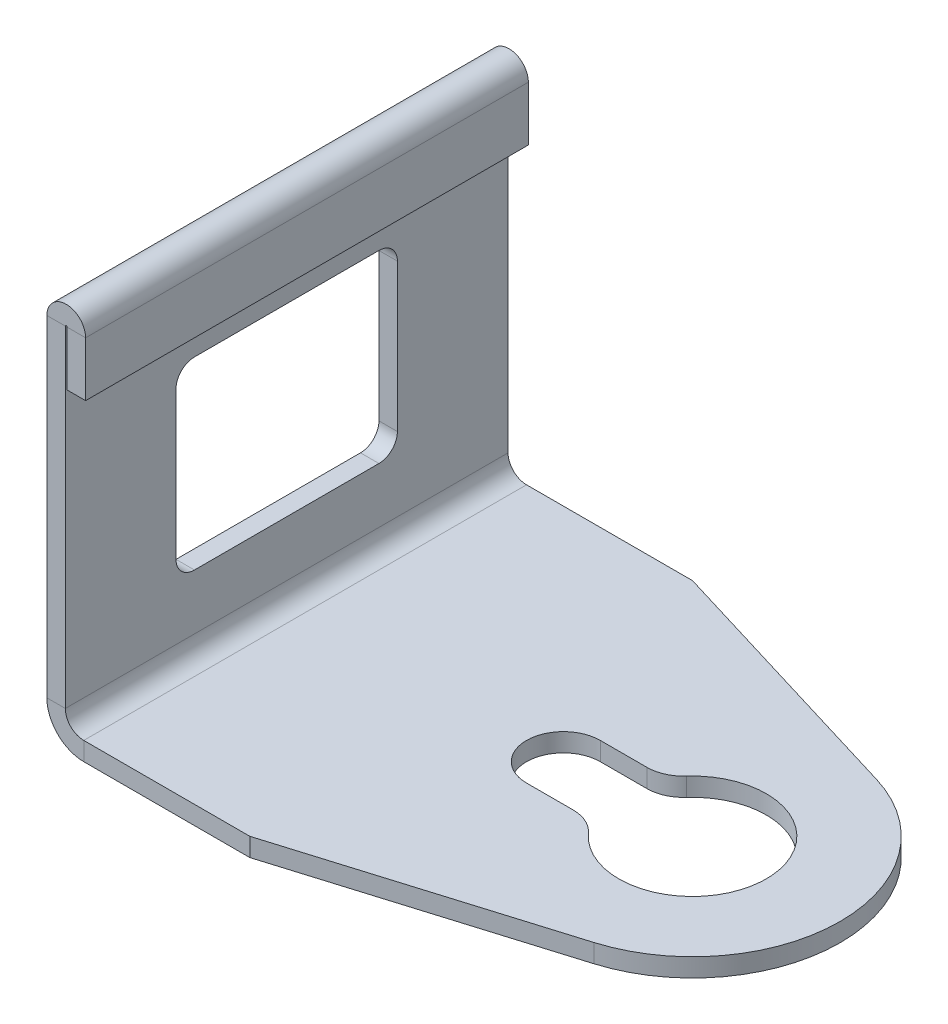
ISO-10303-21;
HEADER;
FILE_DESCRIPTION(('STEP AP214'),'2;1');
FILE_NAME('part.step','',(''),(''),'','','');
FILE_SCHEMA(('AUTOMOTIVE_DESIGN { 1 0 10303 214 1 1 1 1 }'));
ENDSEC;
DATA;
#1=APPLICATION_CONTEXT('core data for automotive mechanical design processes');
#2=APPLICATION_PROTOCOL_DEFINITION('international standard','automotive_design',2000,#1);
#3=PRODUCT_CONTEXT('',#1,'mechanical');
#4=PRODUCT('Part','Part','',(#3));
#5=PRODUCT_RELATED_PRODUCT_CATEGORY('part','',(#4));
#6=PRODUCT_DEFINITION_FORMATION('','',#4);
#7=PRODUCT_DEFINITION_CONTEXT('part definition',#1,'design');
#8=PRODUCT_DEFINITION('design','',#6,#7);
#9=PRODUCT_DEFINITION_SHAPE('','',#8);
#10=(LENGTH_UNIT() NAMED_UNIT(*) SI_UNIT(.MILLI.,.METRE.));
#11=(NAMED_UNIT(*) PLANE_ANGLE_UNIT() SI_UNIT($,.RADIAN.));
#12=(NAMED_UNIT(*) SI_UNIT($,.STERADIAN.) SOLID_ANGLE_UNIT());
#13=UNCERTAINTY_MEASURE_WITH_UNIT(LENGTH_MEASURE(1.E-05),#10,'distance_accuracy_value','');
#14=(GEOMETRIC_REPRESENTATION_CONTEXT(3) GLOBAL_UNCERTAINTY_ASSIGNED_CONTEXT((#13)) GLOBAL_UNIT_ASSIGNED_CONTEXT((#10,
#11,#12)) REPRESENTATION_CONTEXT('',''));
#15=CARTESIAN_POINT('',(0.,0.,0.));
#16=DIRECTION('',(0.,0.,1.));
#17=DIRECTION('',(1.,0.,0.));
#18=AXIS2_PLACEMENT_3D('',#15,#16,#17);
#19=CARTESIAN_POINT('',(-2.,0.,12.));
#20=DIRECTION('',(0.,0.,1.));
#21=DIRECTION('',(1.,0.,0.));
#22=AXIS2_PLACEMENT_3D('',#19,#20,#21);
#23=PLANE('',#22);
#24=DIRECTION('',(0.,1.,0.));
#25=VECTOR('',#24,1.);
#26=CARTESIAN_POINT('',(-0.999999999999997,0.,12.));
#27=LINE('',#26,#25);
#28=CARTESIAN_POINT('',(-1.00000000000006,18.95,12.));
#29=VERTEX_POINT('',#28);
#30=CARTESIAN_POINT('',(-1.,0.999999999999997,12.));
#31=VERTEX_POINT('',#30);
#32=EDGE_CURVE('E376',#29,#31,#27,.F.);
#33=ORIENTED_EDGE('',*,*,#32,.F.);
#34=DIRECTION('',(-1.,0.,0.));
#35=VECTOR('',#34,1.);
#36=CARTESIAN_POINT('',(-1.00000000000006,18.95,12.));
#37=LINE('',#36,#35);
#38=CARTESIAN_POINT('',(-2.00000000000006,18.95,12.));
#39=VERTEX_POINT('',#38);
#40=EDGE_CURVE('E323',#29,#39,#37,.T.);
#41=ORIENTED_EDGE('',*,*,#40,.T.);
#42=DIRECTION('',(0.,-1.,0.));
#43=VECTOR('',#42,1.);
#44=CARTESIAN_POINT('',(-2.,0.,12.));
#45=LINE('',#44,#43);
#46=CARTESIAN_POINT('',(-2.,0.999999999999993,12.));
#47=VERTEX_POINT('',#46);
#48=EDGE_CURVE('E370',#39,#47,#45,.T.);
#49=ORIENTED_EDGE('',*,*,#48,.T.);
#50=DIRECTION('',(-1.,0.,0.));
#51=VECTOR('',#50,1.);
#52=CARTESIAN_POINT('',(-1.,0.999999999999997,12.));
#53=LINE('',#52,#51);
#54=EDGE_CURVE('E384',#31,#47,#53,.T.);
#55=ORIENTED_EDGE('',*,*,#54,.F.);
#56=EDGE_LOOP('',(#33,#41,#49,#55));
#57=FACE_BOUND('',#56,.T.);
#58=ADVANCED_FACE('F61',(#57),#23,.T.);
#59=CARTESIAN_POINT('',(0.,-1.,-12.));
#60=DIRECTION('',(0.,0.,-1.));
#61=DIRECTION('',(-1.,0.,0.));
#62=AXIS2_PLACEMENT_3D('',#59,#60,#61);
#63=PLANE('',#62);
#64=DIRECTION('',(-1.,0.,0.));
#65=VECTOR('',#64,1.);
#66=CARTESIAN_POINT('',(0.,0.,-12.));
#67=LINE('',#66,#65);
#68=CARTESIAN_POINT('',(9.,0.,-12.));
#69=VERTEX_POINT('',#68);
#70=CARTESIAN_POINT('',(0.,0.,-12.));
#71=VERTEX_POINT('',#70);
#72=EDGE_CURVE('E456',#69,#71,#67,.T.);
#73=ORIENTED_EDGE('',*,*,#72,.F.);
#74=DIRECTION('',(0.,1.,0.));
#75=VECTOR('',#74,1.);
#76=CARTESIAN_POINT('',(9.,-1.,-12.));
#77=LINE('',#76,#75);
#78=CARTESIAN_POINT('',(9.,-1.,-12.));
#79=VERTEX_POINT('',#78);
#80=EDGE_CURVE('E70',#79,#69,#77,.T.);
#81=ORIENTED_EDGE('',*,*,#80,.F.);
#82=DIRECTION('',(-1.,0.,0.));
#83=VECTOR('',#82,1.);
#84=CARTESIAN_POINT('',(0.,-1.,-12.));
#85=LINE('',#84,#83);
#86=CARTESIAN_POINT('',(0.,-1.,-12.));
#87=VERTEX_POINT('',#86);
#88=EDGE_CURVE('E468',#79,#87,#85,.T.);
#89=ORIENTED_EDGE('',*,*,#88,.T.);
#90=DIRECTION('',(0.,1.,0.));
#91=VECTOR('',#90,1.);
#92=CARTESIAN_POINT('',(0.,-1.,-12.));
#93=LINE('',#92,#91);
#94=EDGE_CURVE('E13',#87,#71,#93,.T.);
#95=ORIENTED_EDGE('',*,*,#94,.T.);
#96=EDGE_LOOP('',(#73,#81,#89,#95));
#97=FACE_BOUND('',#96,.T.);
#98=ADVANCED_FACE('F537',(#97),#63,.T.);
#99=CARTESIAN_POINT('',(9.,-1.,-12.));
#100=DIRECTION('',(0.29027623112899,0.,-0.956942897795657));
#101=DIRECTION('',(-0.956942897795657,0.,-0.29027623112899));
#102=AXIS2_PLACEMENT_3D('',#99,#100,#101);
#103=PLANE('',#102);
#104=DIRECTION('',(-0.956942897795657,0.,-0.29027623112899));
#105=VECTOR('',#104,1.);
#106=CARTESIAN_POINT('',(9.,0.,-12.));
#107=LINE('',#106,#105);
#108=CARTESIAN_POINT('',(23.3222098490319,0.,-7.65554318236525));
#109=VERTEX_POINT('',#108);
#110=EDGE_CURVE('E482',#109,#69,#107,.T.);
#111=ORIENTED_EDGE('',*,*,#110,.F.);
#112=DIRECTION('',(0.,1.,0.));
#113=VECTOR('',#112,1.);
#114=CARTESIAN_POINT('',(23.3222098490319,-1.,-7.65554318236525));
#115=LINE('',#114,#113);
#116=CARTESIAN_POINT('',(23.3222098490319,-1.,-7.65554318236525));
#117=VERTEX_POINT('',#116);
#118=EDGE_CURVE('E488',#117,#109,#115,.T.);
#119=ORIENTED_EDGE('',*,*,#118,.F.);
#120=DIRECTION('',(-0.956942897795657,0.,-0.29027623112899));
#121=VECTOR('',#120,1.);
#122=CARTESIAN_POINT('',(9.,-1.,-12.));
#123=LINE('',#122,#121);
#124=EDGE_CURVE('E465',#117,#79,#123,.T.);
#125=ORIENTED_EDGE('',*,*,#124,.T.);
#126=ORIENTED_EDGE('',*,*,#80,.T.);
#127=EDGE_LOOP('',(#111,#119,#125,#126));
#128=FACE_BOUND('',#127,.T.);
#129=ADVANCED_FACE('F557',(#128),#103,.T.);
#130=CARTESIAN_POINT('',(21.,-1.,0.));
#131=DIRECTION('',(0.,1.,0.));
#132=DIRECTION('',(0.,0.,1.));
#133=AXIS2_PLACEMENT_3D('',#130,#131,#132);
#134=CYLINDRICAL_SURFACE('',#133,8.);
#135=CARTESIAN_POINT('',(21.,0.,0.));
#136=DIRECTION('',(0.,1.,0.));
#137=DIRECTION('',(0.,0.,1.));
#138=AXIS2_PLACEMENT_3D('',#135,#136,#137);
#139=CIRCLE('',#138,8.);
#140=CARTESIAN_POINT('',(23.3222098490319,0.,7.65554318236525));
#141=VERTEX_POINT('',#140);
#142=EDGE_CURVE('E479',#141,#109,#139,.T.);
#143=ORIENTED_EDGE('',*,*,#142,.F.);
#144=DIRECTION('',(0.,1.,0.));
#145=VECTOR('',#144,1.);
#146=CARTESIAN_POINT('',(23.3222098490319,-1.,7.65554318236525));
#147=LINE('',#146,#145);
#148=CARTESIAN_POINT('',(23.3222098490319,-1.,7.65554318236525));
#149=VERTEX_POINT('',#148);
#150=EDGE_CURVE('E490',#149,#141,#147,.T.);
#151=ORIENTED_EDGE('',*,*,#150,.F.);
#152=CARTESIAN_POINT('',(21.,-1.,0.));
#153=DIRECTION('',(0.,1.,0.));
#154=DIRECTION('',(0.,0.,1.));
#155=AXIS2_PLACEMENT_3D('',#152,#153,#154);
#156=CIRCLE('',#155,8.);
#157=EDGE_CURVE('E462',#149,#117,#156,.T.);
#158=ORIENTED_EDGE('',*,*,#157,.T.);
#159=ORIENTED_EDGE('',*,*,#118,.T.);
#160=EDGE_LOOP('',(#143,#151,#158,#159));
#161=FACE_BOUND('',#160,.T.);
#162=ADVANCED_FACE('F955',(#161),#134,.T.);
#163=CARTESIAN_POINT('',(9.,-1.,12.));
#164=DIRECTION('',(0.29027623112899,0.,0.956942897795657));
#165=DIRECTION('',(0.956942897795657,0.,-0.29027623112899));
#166=AXIS2_PLACEMENT_3D('',#163,#164,#165);
#167=PLANE('',#166);
#168=DIRECTION('',(0.956942897795657,0.,-0.29027623112899));
#169=VECTOR('',#168,1.);
#170=CARTESIAN_POINT('',(9.,0.,12.));
#171=LINE('',#170,#169);
#172=CARTESIAN_POINT('',(9.,0.,12.));
#173=VERTEX_POINT('',#172);
#174=EDGE_CURVE('E476',#173,#141,#171,.T.);
#175=ORIENTED_EDGE('',*,*,#174,.F.);
#176=DIRECTION('',(0.,1.,0.));
#177=VECTOR('',#176,1.);
#178=CARTESIAN_POINT('',(9.,-1.,12.));
#179=LINE('',#178,#177);
#180=CARTESIAN_POINT('',(9.,-1.,12.));
#181=VERTEX_POINT('',#180);
#182=EDGE_CURVE('E491',#181,#173,#179,.T.);
#183=ORIENTED_EDGE('',*,*,#182,.F.);
#184=DIRECTION('',(0.956942897795657,0.,-0.29027623112899));
#185=VECTOR('',#184,1.);
#186=CARTESIAN_POINT('',(9.,-1.,12.));
#187=LINE('',#186,#185);
#188=EDGE_CURVE('E459',#181,#149,#187,.T.);
#189=ORIENTED_EDGE('',*,*,#188,.T.);
#190=ORIENTED_EDGE('',*,*,#150,.T.);
#191=EDGE_LOOP('',(#175,#183,#189,#190));
#192=FACE_BOUND('',#191,.T.);
#193=ADVANCED_FACE('F946',(#192),#167,.T.);
#194=CARTESIAN_POINT('',(0.,-1.,12.));
#195=DIRECTION('',(0.,0.,1.));
#196=DIRECTION('',(1.,0.,0.));
#197=AXIS2_PLACEMENT_3D('',#194,#195,#196);
#198=PLANE('',#197);
#199=DIRECTION('',(1.,0.,0.));
#200=VECTOR('',#199,1.);
#201=CARTESIAN_POINT('',(0.,0.,12.));
#202=LINE('',#201,#200);
#203=CARTESIAN_POINT('',(0.,0.,12.));
#204=VERTEX_POINT('',#203);
#205=EDGE_CURVE('E473',#204,#173,#202,.T.);
#206=ORIENTED_EDGE('',*,*,#205,.F.);
#207=DIRECTION('',(0.,1.,0.));
#208=VECTOR('',#207,1.);
#209=CARTESIAN_POINT('',(0.,-1.,12.));
#210=LINE('',#209,#208);
#211=CARTESIAN_POINT('',(0.,-1.,12.));
#212=VERTEX_POINT('',#211);
#213=EDGE_CURVE('E65',#212,#204,#210,.T.);
#214=ORIENTED_EDGE('',*,*,#213,.F.);
#215=DIRECTION('',(1.,0.,0.));
#216=VECTOR('',#215,1.);
#217=CARTESIAN_POINT('',(0.,-1.,12.));
#218=LINE('',#217,#216);
#219=EDGE_CURVE('E455',#212,#181,#218,.T.);
#220=ORIENTED_EDGE('',*,*,#219,.T.);
#221=ORIENTED_EDGE('',*,*,#182,.T.);
#222=EDGE_LOOP('',(#206,#214,#220,#221));
#223=FACE_BOUND('',#222,.T.);
#224=ADVANCED_FACE('F63',(#223),#198,.T.);
#225=CARTESIAN_POINT('',(21.,-1.,0.));
#226=DIRECTION('',(0.,1.,0.));
#227=DIRECTION('',(0.,0.,1.));
#228=AXIS2_PLACEMENT_3D('',#225,#226,#227);
#229=PLANE('',#228);
#230=CARTESIAN_POINT('',(21.,-1.,0.));
#231=DIRECTION('',(0.,1.,0.));
#232=DIRECTION('',(0.,0.,1.));
#233=AXIS2_PLACEMENT_3D('',#230,#231,#232);
#234=CIRCLE('',#233,4.);
#235=CARTESIAN_POINT('',(18.0185760300003,-1.,2.66666666666667));
#236=VERTEX_POINT('',#235);
#237=CARTESIAN_POINT('',(18.0185760300003,-1.,-2.66666666666667));
#238=VERTEX_POINT('',#237);
#239=EDGE_CURVE('E420',#236,#238,#234,.T.);
#240=ORIENTED_EDGE('',*,*,#239,.T.);
#241=CARTESIAN_POINT('',(16.5278640450004,-1.,-4.));
#242=DIRECTION('',(0.,-1.,0.));
#243=DIRECTION('',(0.,0.,1.));
#244=AXIS2_PLACEMENT_3D('',#241,#242,#243);
#245=CIRCLE('',#244,2.);
#246=CARTESIAN_POINT('',(16.5278640450004,-1.,-2.));
#247=VERTEX_POINT('',#246);
#248=EDGE_CURVE('E404',#238,#247,#245,.T.);
#249=ORIENTED_EDGE('',*,*,#248,.T.);
#250=DIRECTION('',(-1.,0.,0.));
#251=VECTOR('',#250,1.);
#252=CARTESIAN_POINT('',(14.,-1.,-2.));
#253=LINE('',#252,#251);
#254=CARTESIAN_POINT('',(14.,-1.,-2.));
#255=VERTEX_POINT('',#254);
#256=EDGE_CURVE('E407',#247,#255,#253,.T.);
#257=ORIENTED_EDGE('',*,*,#256,.T.);
#258=CARTESIAN_POINT('',(14.,-1.,0.));
#259=DIRECTION('',(0.,1.,0.));
#260=DIRECTION('',(0.,0.,1.));
#261=AXIS2_PLACEMENT_3D('',#258,#259,#260);
#262=CIRCLE('',#261,2.);
#263=CARTESIAN_POINT('',(14.,-1.,2.));
#264=VERTEX_POINT('',#263);
#265=EDGE_CURVE('E411',#255,#264,#262,.T.);
#266=ORIENTED_EDGE('',*,*,#265,.T.);
#267=DIRECTION('',(1.,0.,0.));
#268=VECTOR('',#267,1.);
#269=CARTESIAN_POINT('',(14.,-1.,2.));
#270=LINE('',#269,#268);
#271=CARTESIAN_POINT('',(16.5278640450004,-1.,2.));
#272=VERTEX_POINT('',#271);
#273=EDGE_CURVE('E414',#264,#272,#270,.T.);
#274=ORIENTED_EDGE('',*,*,#273,.T.);
#275=CARTESIAN_POINT('',(16.5278640450004,-1.,4.));
#276=DIRECTION('',(0.,-1.,0.));
#277=DIRECTION('',(0.,0.,-1.));
#278=AXIS2_PLACEMENT_3D('',#275,#276,#277);
#279=CIRCLE('',#278,2.);
#280=EDGE_CURVE('E417',#272,#236,#279,.T.);
#281=ORIENTED_EDGE('',*,*,#280,.T.);
#282=EDGE_LOOP('',(#240,#249,#257,#266,#274,#281));
#283=FACE_BOUND('',#282,.T.);
#284=DIRECTION('',(0.,0.,1.));
#285=VECTOR('',#284,1.);
#286=CARTESIAN_POINT('',(0.,-1.,-12.));
#287=LINE('',#286,#285);
#288=EDGE_CURVE('E452',#87,#212,#287,.T.);
#289=ORIENTED_EDGE('',*,*,#288,.F.);
#290=ORIENTED_EDGE('',*,*,#88,.F.);
#291=ORIENTED_EDGE('',*,*,#124,.F.);
#292=ORIENTED_EDGE('',*,*,#157,.F.);
#293=ORIENTED_EDGE('',*,*,#188,.F.);
#294=ORIENTED_EDGE('',*,*,#219,.F.);
#295=EDGE_LOOP('',(#289,#290,#291,#292,#293,#294));
#296=FACE_BOUND('',#295,.T.);
#297=ADVANCED_FACE('F531',(#283,#296),#229,.F.);
#298=CARTESIAN_POINT('',(21.,0.,0.));
#299=DIRECTION('',(0.,1.,0.));
#300=DIRECTION('',(0.,0.,1.));
#301=AXIS2_PLACEMENT_3D('',#298,#299,#300);
#302=PLANE('',#301);
#303=CARTESIAN_POINT('',(16.5278640450004,0.,-4.));
#304=DIRECTION('',(0.,-1.,0.));
#305=DIRECTION('',(0.,0.,1.));
#306=AXIS2_PLACEMENT_3D('',#303,#304,#305);
#307=CIRCLE('',#306,2.);
#308=CARTESIAN_POINT('',(18.0185760300003,0.,-2.66666666666667));
#309=VERTEX_POINT('',#308);
#310=CARTESIAN_POINT('',(16.5278640450004,0.,-2.));
#311=VERTEX_POINT('',#310);
#312=EDGE_CURVE('E395',#309,#311,#307,.T.);
#313=ORIENTED_EDGE('',*,*,#312,.F.);
#314=CARTESIAN_POINT('',(21.,0.,0.));
#315=DIRECTION('',(0.,1.,0.));
#316=DIRECTION('',(0.,0.,1.));
#317=AXIS2_PLACEMENT_3D('',#314,#315,#316);
#318=CIRCLE('',#317,4.);
#319=CARTESIAN_POINT('',(18.0185760300003,0.,2.66666666666667));
#320=VERTEX_POINT('',#319);
#321=EDGE_CURVE('E408',#320,#309,#318,.T.);
#322=ORIENTED_EDGE('',*,*,#321,.F.);
#323=CARTESIAN_POINT('',(16.5278640450004,0.,4.));
#324=DIRECTION('',(0.,-1.,0.));
#325=DIRECTION('',(0.,0.,-1.));
#326=AXIS2_PLACEMENT_3D('',#323,#324,#325);
#327=CIRCLE('',#326,2.);
#328=CARTESIAN_POINT('',(16.5278640450004,0.,2.));
#329=VERTEX_POINT('',#328);
#330=EDGE_CURVE('E434',#329,#320,#327,.T.);
#331=ORIENTED_EDGE('',*,*,#330,.F.);
#332=DIRECTION('',(1.,0.,0.));
#333=VECTOR('',#332,1.);
#334=CARTESIAN_POINT('',(14.,0.,2.));
#335=LINE('',#334,#333);
#336=CARTESIAN_POINT('',(14.,0.,2.));
#337=VERTEX_POINT('',#336);
#338=EDGE_CURVE('E431',#337,#329,#335,.T.);
#339=ORIENTED_EDGE('',*,*,#338,.F.);
#340=CARTESIAN_POINT('',(14.,0.,0.));
#341=DIRECTION('',(0.,1.,0.));
#342=DIRECTION('',(0.,0.,1.));
#343=AXIS2_PLACEMENT_3D('',#340,#341,#342);
#344=CIRCLE('',#343,2.);
#345=CARTESIAN_POINT('',(14.,0.,-2.));
#346=VERTEX_POINT('',#345);
#347=EDGE_CURVE('E428',#346,#337,#344,.T.);
#348=ORIENTED_EDGE('',*,*,#347,.F.);
#349=DIRECTION('',(-1.,0.,0.));
#350=VECTOR('',#349,1.);
#351=CARTESIAN_POINT('',(14.,0.,-2.));
#352=LINE('',#351,#350);
#353=EDGE_CURVE('E425',#311,#346,#352,.T.);
#354=ORIENTED_EDGE('',*,*,#353,.F.);
#355=EDGE_LOOP('',(#313,#322,#331,#339,#348,#354));
#356=FACE_BOUND('',#355,.T.);
#357=DIRECTION('',(0.,0.,1.));
#358=VECTOR('',#357,1.);
#359=CARTESIAN_POINT('',(0.,0.,-12.));
#360=LINE('',#359,#358);
#361=EDGE_CURVE('E441',#71,#204,#360,.T.);
#362=ORIENTED_EDGE('',*,*,#361,.T.);
#363=ORIENTED_EDGE('',*,*,#205,.T.);
#364=ORIENTED_EDGE('',*,*,#174,.T.);
#365=ORIENTED_EDGE('',*,*,#142,.T.);
#366=ORIENTED_EDGE('',*,*,#110,.T.);
#367=ORIENTED_EDGE('',*,*,#72,.T.);
#368=EDGE_LOOP('',(#362,#363,#364,#365,#366,#367));
#369=FACE_BOUND('',#368,.T.);
#370=ADVANCED_FACE('F912',(#356,#369),#302,.T.);
#371=CARTESIAN_POINT('',(16.5278640450004,-1.,-4.));
#372=DIRECTION('',(0.,1.,0.));
#373=DIRECTION('',(0.,0.,1.));
#374=AXIS2_PLACEMENT_3D('',#371,#372,#373);
#375=CYLINDRICAL_SURFACE('',#374,2.);
#376=ORIENTED_EDGE('',*,*,#312,.T.);
#377=DIRECTION('',(0.,1.,0.));
#378=VECTOR('',#377,1.);
#379=CARTESIAN_POINT('',(16.5278640450004,-1.,-2.));
#380=LINE('',#379,#378);
#381=EDGE_CURVE('E423',#247,#311,#380,.T.);
#382=ORIENTED_EDGE('',*,*,#381,.F.);
#383=ORIENTED_EDGE('',*,*,#248,.F.);
#384=DIRECTION('',(0.,1.,0.));
#385=VECTOR('',#384,1.);
#386=CARTESIAN_POINT('',(18.0185760300003,-1.,-2.66666666666667));
#387=LINE('',#386,#385);
#388=EDGE_CURVE('E439',#238,#309,#387,.T.);
#389=ORIENTED_EDGE('',*,*,#388,.T.);
#390=EDGE_LOOP('',(#376,#382,#383,#389));
#391=FACE_BOUND('',#390,.T.);
#392=ADVANCED_FACE('F900',(#391),#375,.T.);
#393=CARTESIAN_POINT('',(21.,-1.,0.));
#394=DIRECTION('',(0.,1.,0.));
#395=DIRECTION('',(0.,0.,1.));
#396=AXIS2_PLACEMENT_3D('',#393,#394,#395);
#397=CYLINDRICAL_SURFACE('',#396,4.);
#398=ORIENTED_EDGE('',*,*,#321,.T.);
#399=ORIENTED_EDGE('',*,*,#388,.F.);
#400=ORIENTED_EDGE('',*,*,#239,.F.);
#401=DIRECTION('',(0.,1.,0.));
#402=VECTOR('',#401,1.);
#403=CARTESIAN_POINT('',(18.0185760300003,-1.,2.66666666666667));
#404=LINE('',#403,#402);
#405=EDGE_CURVE('E442',#236,#320,#404,.T.);
#406=ORIENTED_EDGE('',*,*,#405,.T.);
#407=EDGE_LOOP('',(#398,#399,#400,#406));
#408=FACE_BOUND('',#407,.T.);
#409=ADVANCED_FACE('F888',(#408),#397,.F.);
#410=CARTESIAN_POINT('',(16.5278640450004,-1.,4.));
#411=DIRECTION('',(0.,1.,0.));
#412=DIRECTION('',(0.,0.,1.));
#413=AXIS2_PLACEMENT_3D('',#410,#411,#412);
#414=CYLINDRICAL_SURFACE('',#413,2.);
#415=ORIENTED_EDGE('',*,*,#330,.T.);
#416=ORIENTED_EDGE('',*,*,#405,.F.);
#417=ORIENTED_EDGE('',*,*,#280,.F.);
#418=DIRECTION('',(0.,1.,0.));
#419=VECTOR('',#418,1.);
#420=CARTESIAN_POINT('',(16.5278640450004,-1.,2.));
#421=LINE('',#420,#419);
#422=EDGE_CURVE('E444',#272,#329,#421,.T.);
#423=ORIENTED_EDGE('',*,*,#422,.T.);
#424=EDGE_LOOP('',(#415,#416,#417,#423));
#425=FACE_BOUND('',#424,.T.);
#426=ADVANCED_FACE('F876',(#425),#414,.T.);
#427=CARTESIAN_POINT('',(14.,-1.,2.));
#428=DIRECTION('',(0.,0.,1.));
#429=DIRECTION('',(1.,0.,0.));
#430=AXIS2_PLACEMENT_3D('',#427,#428,#429);
#431=PLANE('',#430);
#432=ORIENTED_EDGE('',*,*,#338,.T.);
#433=ORIENTED_EDGE('',*,*,#422,.F.);
#434=ORIENTED_EDGE('',*,*,#273,.F.);
#435=DIRECTION('',(0.,1.,0.));
#436=VECTOR('',#435,1.);
#437=CARTESIAN_POINT('',(14.,-1.,2.));
#438=LINE('',#437,#436);
#439=EDGE_CURVE('E446',#264,#337,#438,.T.);
#440=ORIENTED_EDGE('',*,*,#439,.T.);
#441=EDGE_LOOP('',(#432,#433,#434,#440));
#442=FACE_BOUND('',#441,.T.);
#443=ADVANCED_FACE('F864',(#442),#431,.F.);
#444=CARTESIAN_POINT('',(14.,-1.,0.));
#445=DIRECTION('',(0.,1.,0.));
#446=DIRECTION('',(0.,0.,1.));
#447=AXIS2_PLACEMENT_3D('',#444,#445,#446);
#448=CYLINDRICAL_SURFACE('',#447,2.);
#449=ORIENTED_EDGE('',*,*,#347,.T.);
#450=ORIENTED_EDGE('',*,*,#439,.F.);
#451=ORIENTED_EDGE('',*,*,#265,.F.);
#452=DIRECTION('',(0.,1.,0.));
#453=VECTOR('',#452,1.);
#454=CARTESIAN_POINT('',(14.,-1.,-2.));
#455=LINE('',#454,#453);
#456=EDGE_CURVE('E448',#255,#346,#455,.T.);
#457=ORIENTED_EDGE('',*,*,#456,.T.);
#458=EDGE_LOOP('',(#449,#450,#451,#457));
#459=FACE_BOUND('',#458,.T.);
#460=ADVANCED_FACE('F548',(#459),#448,.F.);
#461=CARTESIAN_POINT('',(14.,-1.,-2.));
#462=DIRECTION('',(0.,0.,-1.));
#463=DIRECTION('',(-1.,0.,0.));
#464=AXIS2_PLACEMENT_3D('',#461,#462,#463);
#465=PLANE('',#464);
#466=ORIENTED_EDGE('',*,*,#353,.T.);
#467=ORIENTED_EDGE('',*,*,#456,.F.);
#468=ORIENTED_EDGE('',*,*,#256,.F.);
#469=ORIENTED_EDGE('',*,*,#381,.T.);
#470=EDGE_LOOP('',(#466,#467,#468,#469));
#471=FACE_BOUND('',#470,.T.);
#472=ADVANCED_FACE('F541',(#471),#465,.F.);
#473=CARTESIAN_POINT('',(0.,1.,-12.));
#474=DIRECTION('',(0.,0.,-1.));
#475=DIRECTION('',(-1.,0.,0.));
#476=AXIS2_PLACEMENT_3D('',#473,#474,#475);
#477=PLANE('',#476);
#478=DIRECTION('',(-1.,0.,0.));
#479=VECTOR('',#478,1.);
#480=CARTESIAN_POINT('',(-2.,0.999999999999994,-12.));
#481=LINE('',#480,#479);
#482=CARTESIAN_POINT('',(-1.,0.999999999999997,-12.));
#483=VERTEX_POINT('',#482);
#484=CARTESIAN_POINT('',(-2.,0.999999999999993,-12.));
#485=VERTEX_POINT('',#484);
#486=EDGE_CURVE('E368',#483,#485,#481,.T.);
#487=ORIENTED_EDGE('',*,*,#486,.F.);
#488=CARTESIAN_POINT('',(0.,1.,-12.));
#489=DIRECTION('',(0.,0.,1.));
#490=DIRECTION('',(1.,0.,0.));
#491=AXIS2_PLACEMENT_3D('',#488,#489,#490);
#492=CIRCLE('',#491,1.);
#493=EDGE_CURVE('E399',#71,#483,#492,.F.);
#494=ORIENTED_EDGE('',*,*,#493,.F.);
#495=ORIENTED_EDGE('',*,*,#94,.F.);
#496=CARTESIAN_POINT('',(0.,1.,-12.));
#497=DIRECTION('',(0.,0.,1.));
#498=DIRECTION('',(1.,0.,0.));
#499=AXIS2_PLACEMENT_3D('',#496,#497,#498);
#500=CIRCLE('',#499,2.);
#501=EDGE_CURVE('E392',#87,#485,#500,.F.);
#502=ORIENTED_EDGE('',*,*,#501,.T.);
#503=EDGE_LOOP('',(#487,#494,#495,#502));
#504=FACE_BOUND('',#503,.T.);
#505=ADVANCED_FACE('F539',(#504),#477,.T.);
#506=CARTESIAN_POINT('',(0.,1.,12.));
#507=DIRECTION('',(0.,0.,-1.));
#508=DIRECTION('',(-1.,0.,0.));
#509=AXIS2_PLACEMENT_3D('',#506,#507,#508);
#510=PLANE('',#509);
#511=CARTESIAN_POINT('',(0.,1.,12.));
#512=DIRECTION('',(0.,0.,1.));
#513=DIRECTION('',(1.,0.,0.));
#514=AXIS2_PLACEMENT_3D('',#511,#512,#513);
#515=CIRCLE('',#514,1.);
#516=EDGE_CURVE('E372',#31,#204,#515,.T.);
#517=ORIENTED_EDGE('',*,*,#516,.F.);
#518=ORIENTED_EDGE('',*,*,#54,.T.);
#519=CARTESIAN_POINT('',(0.,1.,12.));
#520=DIRECTION('',(0.,0.,1.));
#521=DIRECTION('',(1.,0.,0.));
#522=AXIS2_PLACEMENT_3D('',#519,#520,#521);
#523=CIRCLE('',#522,2.);
#524=EDGE_CURVE('E396',#47,#212,#523,.T.);
#525=ORIENTED_EDGE('',*,*,#524,.T.);
#526=ORIENTED_EDGE('',*,*,#213,.T.);
#527=EDGE_LOOP('',(#517,#518,#525,#526));
#528=FACE_BOUND('',#527,.T.);
#529=ADVANCED_FACE('F498',(#528),#510,.F.);
#530=CARTESIAN_POINT('',(0.,1.,12.));
#531=DIRECTION('',(0.,0.,1.));
#532=DIRECTION('',(-1.,0.,0.));
#533=AXIS2_PLACEMENT_3D('',#530,#531,#532);
#534=CYLINDRICAL_SURFACE('',#533,2.);
#535=ORIENTED_EDGE('',*,*,#288,.T.);
#536=ORIENTED_EDGE('',*,*,#524,.F.);
#537=DIRECTION('',(0.,0.,1.));
#538=VECTOR('',#537,1.);
#539=CARTESIAN_POINT('',(-2.,0.999999999999993,0.));
#540=LINE('',#539,#538);
#541=EDGE_CURVE('E381',#485,#47,#540,.T.);
#542=ORIENTED_EDGE('',*,*,#541,.F.);
#543=ORIENTED_EDGE('',*,*,#501,.F.);
#544=EDGE_LOOP('',(#535,#536,#542,#543));
#545=FACE_BOUND('',#544,.T.);
#546=ADVANCED_FACE('F527',(#545),#534,.T.);
#547=CARTESIAN_POINT('',(0.,1.,12.));
#548=DIRECTION('',(0.,0.,1.));
#549=DIRECTION('',(-1.,0.,0.));
#550=AXIS2_PLACEMENT_3D('',#547,#548,#549);
#551=CYLINDRICAL_SURFACE('',#550,1.);
#552=ORIENTED_EDGE('',*,*,#361,.F.);
#553=ORIENTED_EDGE('',*,*,#493,.T.);
#554=DIRECTION('',(0.,0.,-1.));
#555=VECTOR('',#554,1.);
#556=CARTESIAN_POINT('',(-1.,0.999999999999997,-12.));
#557=LINE('',#556,#555);
#558=EDGE_CURVE('E387',#483,#31,#557,.F.);
#559=ORIENTED_EDGE('',*,*,#558,.T.);
#560=ORIENTED_EDGE('',*,*,#516,.T.);
#561=EDGE_LOOP('',(#552,#553,#559,#560));
#562=FACE_BOUND('',#561,.T.);
#563=ADVANCED_FACE('F503',(#562),#551,.F.);
#564=CARTESIAN_POINT('',(-2.00000000000007,20.,-12.));
#565=DIRECTION('',(0.,0.,-1.));
#566=DIRECTION('',(-1.,0.,0.));
#567=AXIS2_PLACEMENT_3D('',#564,#565,#566);
#568=PLANE('',#567);
#569=DIRECTION('',(-1.,0.,0.));
#570=VECTOR('',#569,1.);
#571=CARTESIAN_POINT('',(-1.00000000000006,18.95,-12.));
#572=LINE('',#571,#570);
#573=CARTESIAN_POINT('',(-1.00000000000006,18.95,-12.));
#574=VERTEX_POINT('',#573);
#575=CARTESIAN_POINT('',(-2.00000000000006,18.95,-12.));
#576=VERTEX_POINT('',#575);
#577=EDGE_CURVE('E332',#574,#576,#572,.T.);
#578=ORIENTED_EDGE('',*,*,#577,.F.);
#579=DIRECTION('',(0.,-1.,0.));
#580=VECTOR('',#579,1.);
#581=CARTESIAN_POINT('',(-0.999999999999997,0.,-12.));
#582=LINE('',#581,#580);
#583=EDGE_CURVE('E378',#483,#574,#582,.F.);
#584=ORIENTED_EDGE('',*,*,#583,.F.);
#585=ORIENTED_EDGE('',*,*,#486,.T.);
#586=DIRECTION('',(0.,1.,0.));
#587=VECTOR('',#586,1.);
#588=CARTESIAN_POINT('',(-2.00000000000007,20.,-12.));
#589=LINE('',#588,#587);
#590=EDGE_CURVE('E373',#485,#576,#589,.T.);
#591=ORIENTED_EDGE('',*,*,#590,.T.);
#592=EDGE_LOOP('',(#578,#584,#585,#591));
#593=FACE_BOUND('',#592,.T.);
#594=ADVANCED_FACE('F513',(#593),#568,.T.);
#595=CARTESIAN_POINT('',(-2.,0.,0.));
#596=DIRECTION('',(-1.,0.,0.));
#597=DIRECTION('',(0.,-1.,0.));
#598=AXIS2_PLACEMENT_3D('',#595,#596,#597);
#599=PLANE('',#598);
#600=CARTESIAN_POINT('',(-2.00000000000001,4.99999999999991,-5.));
#601=DIRECTION('',(1.,0.,0.));
#602=DIRECTION('',(0.,1.,0.));
#603=AXIS2_PLACEMENT_3D('',#600,#601,#602);
#604=CIRCLE('',#603,1.);
#605=CARTESIAN_POINT('',(-2.00000000000001,3.99999999999991,-4.99999999999999));
#606=VERTEX_POINT('',#605);
#607=CARTESIAN_POINT('',(-2.00000000000001,4.99999999999992,-6.));
#608=VERTEX_POINT('',#607);
#609=EDGE_CURVE('E249',#606,#608,#604,.T.);
#610=ORIENTED_EDGE('',*,*,#609,.T.);
#611=DIRECTION('',(0.,1.,0.));
#612=VECTOR('',#611,1.);
#613=CARTESIAN_POINT('',(-2.00000000000004,12.9999999999999,-6.));
#614=LINE('',#613,#612);
#615=CARTESIAN_POINT('',(-2.00000000000004,12.9999999999999,-6.));
#616=VERTEX_POINT('',#615);
#617=EDGE_CURVE('E258',#608,#616,#614,.T.);
#618=ORIENTED_EDGE('',*,*,#617,.T.);
#619=CARTESIAN_POINT('',(-2.00000000000004,12.9999999999999,-5.));
#620=DIRECTION('',(1.,0.,0.));
#621=DIRECTION('',(0.,-1.,0.));
#622=AXIS2_PLACEMENT_3D('',#619,#620,#621);
#623=CIRCLE('',#622,1.);
#624=CARTESIAN_POINT('',(-2.00000000000005,13.9999999999999,-4.99999999999999));
#625=VERTEX_POINT('',#624);
#626=EDGE_CURVE('E78',#616,#625,#623,.T.);
#627=ORIENTED_EDGE('',*,*,#626,.T.);
#628=DIRECTION('',(0.,0.,1.));
#629=VECTOR('',#628,1.);
#630=CARTESIAN_POINT('',(-2.00000000000005,13.9999999999999,4.99999999999999));
#631=LINE('',#630,#629);
#632=CARTESIAN_POINT('',(-2.00000000000005,13.9999999999999,4.99999999999999));
#633=VERTEX_POINT('',#632);
#634=EDGE_CURVE('E273',#625,#633,#631,.T.);
#635=ORIENTED_EDGE('',*,*,#634,.T.);
#636=CARTESIAN_POINT('',(-2.00000000000004,12.9999999999999,5.));
#637=DIRECTION('',(1.,0.,0.));
#638=DIRECTION('',(0.,1.,0.));
#639=AXIS2_PLACEMENT_3D('',#636,#637,#638);
#640=CIRCLE('',#639,1.);
#641=CARTESIAN_POINT('',(-2.00000000000004,12.9999999999999,6.));
#642=VERTEX_POINT('',#641);
#643=EDGE_CURVE('E276',#633,#642,#640,.T.);
#644=ORIENTED_EDGE('',*,*,#643,.T.);
#645=DIRECTION('',(0.,-1.,0.));
#646=VECTOR('',#645,1.);
#647=CARTESIAN_POINT('',(-2.00000000000004,12.9999999999999,6.));
#648=LINE('',#647,#646);
#649=CARTESIAN_POINT('',(-2.00000000000001,4.99999999999992,6.));
#650=VERTEX_POINT('',#649);
#651=EDGE_CURVE('E279',#642,#650,#648,.T.);
#652=ORIENTED_EDGE('',*,*,#651,.T.);
#653=CARTESIAN_POINT('',(-2.00000000000001,4.99999999999991,5.));
#654=DIRECTION('',(1.,0.,0.));
#655=DIRECTION('',(0.,1.,0.));
#656=AXIS2_PLACEMENT_3D('',#653,#654,#655);
#657=CIRCLE('',#656,1.);
#658=CARTESIAN_POINT('',(-2.00000000000001,3.99999999999991,4.99999999999999));
#659=VERTEX_POINT('',#658);
#660=EDGE_CURVE('E282',#650,#659,#657,.T.);
#661=ORIENTED_EDGE('',*,*,#660,.T.);
#662=DIRECTION('',(0.,0.,-1.));
#663=VECTOR('',#662,1.);
#664=CARTESIAN_POINT('',(-2.00000000000001,3.99999999999991,4.99999999999999));
#665=LINE('',#664,#663);
#666=EDGE_CURVE('E255',#659,#606,#665,.T.);
#667=ORIENTED_EDGE('',*,*,#666,.T.);
#668=EDGE_LOOP('',(#610,#618,#627,#635,#644,#652,#661,#667));
#669=FACE_BOUND('',#668,.T.);
#670=DIRECTION('',(0.,0.,1.));
#671=VECTOR('',#670,1.);
#672=CARTESIAN_POINT('',(-2.00000000000006,18.95,12.));
#673=LINE('',#672,#671);
#674=EDGE_CURVE('E316',#39,#576,#673,.F.);
#675=ORIENTED_EDGE('',*,*,#674,.T.);
#676=ORIENTED_EDGE('',*,*,#590,.F.);
#677=ORIENTED_EDGE('',*,*,#541,.T.);
#678=ORIENTED_EDGE('',*,*,#48,.F.);
#679=EDGE_LOOP('',(#675,#676,#677,#678));
#680=FACE_BOUND('',#679,.T.);
#681=ADVANCED_FACE('F262',(#669,#680),#599,.T.);
#682=CARTESIAN_POINT('',(-0.999999999999997,0.,0.));
#683=DIRECTION('',(-1.,0.,0.));
#684=DIRECTION('',(0.,-1.,0.));
#685=AXIS2_PLACEMENT_3D('',#682,#683,#684);
#686=PLANE('',#685);
#687=DIRECTION('',(0.,1.,0.));
#688=VECTOR('',#687,1.);
#689=CARTESIAN_POINT('',(-1.00000000000004,12.9999999999999,-6.));
#690=LINE('',#689,#688);
#691=CARTESIAN_POINT('',(-1.00000000000001,4.99999999999992,-6.));
#692=VERTEX_POINT('',#691);
#693=CARTESIAN_POINT('',(-1.00000000000004,12.9999999999999,-6.));
#694=VERTEX_POINT('',#693);
#695=EDGE_CURVE('E286',#692,#694,#690,.T.);
#696=ORIENTED_EDGE('',*,*,#695,.F.);
#697=CARTESIAN_POINT('',(-1.00000000000001,4.99999999999991,-5.));
#698=DIRECTION('',(1.,0.,0.));
#699=DIRECTION('',(0.,1.,0.));
#700=AXIS2_PLACEMENT_3D('',#697,#698,#699);
#701=CIRCLE('',#700,1.);
#702=CARTESIAN_POINT('',(-1.00000000000001,3.99999999999992,-4.99999999999999));
#703=VERTEX_POINT('',#702);
#704=EDGE_CURVE('E86',#703,#692,#701,.T.);
#705=ORIENTED_EDGE('',*,*,#704,.F.);
#706=DIRECTION('',(0.,0.,-1.));
#707=VECTOR('',#706,1.);
#708=CARTESIAN_POINT('',(-1.00000000000001,3.99999999999992,4.99999999999999));
#709=LINE('',#708,#707);
#710=CARTESIAN_POINT('',(-1.00000000000001,3.99999999999992,4.99999999999999));
#711=VERTEX_POINT('',#710);
#712=EDGE_CURVE('E266',#711,#703,#709,.T.);
#713=ORIENTED_EDGE('',*,*,#712,.F.);
#714=CARTESIAN_POINT('',(-1.00000000000001,4.99999999999991,5.));
#715=DIRECTION('',(1.,0.,0.));
#716=DIRECTION('',(0.,1.,0.));
#717=AXIS2_PLACEMENT_3D('',#714,#715,#716);
#718=CIRCLE('',#717,1.);
#719=CARTESIAN_POINT('',(-1.00000000000001,4.99999999999992,6.));
#720=VERTEX_POINT('',#719);
#721=EDGE_CURVE('E269',#720,#711,#718,.T.);
#722=ORIENTED_EDGE('',*,*,#721,.F.);
#723=DIRECTION('',(0.,-1.,0.));
#724=VECTOR('',#723,1.);
#725=CARTESIAN_POINT('',(-1.00000000000004,12.9999999999999,6.));
#726=LINE('',#725,#724);
#727=CARTESIAN_POINT('',(-1.00000000000004,12.9999999999999,6.));
#728=VERTEX_POINT('',#727);
#729=EDGE_CURVE('E297',#728,#720,#726,.T.);
#730=ORIENTED_EDGE('',*,*,#729,.F.);
#731=CARTESIAN_POINT('',(-1.00000000000004,12.9999999999999,5.));
#732=DIRECTION('',(1.,0.,0.));
#733=DIRECTION('',(0.,1.,0.));
#734=AXIS2_PLACEMENT_3D('',#731,#732,#733);
#735=CIRCLE('',#734,1.);
#736=CARTESIAN_POINT('',(-1.00000000000005,13.9999999999999,4.99999999999999));
#737=VERTEX_POINT('',#736);
#738=EDGE_CURVE('E294',#737,#728,#735,.T.);
#739=ORIENTED_EDGE('',*,*,#738,.F.);
#740=DIRECTION('',(0.,0.,1.));
#741=VECTOR('',#740,1.);
#742=CARTESIAN_POINT('',(-1.00000000000005,13.9999999999999,4.99999999999999));
#743=LINE('',#742,#741);
#744=CARTESIAN_POINT('',(-1.00000000000005,13.9999999999999,-4.99999999999999));
#745=VERTEX_POINT('',#744);
#746=EDGE_CURVE('E291',#745,#737,#743,.T.);
#747=ORIENTED_EDGE('',*,*,#746,.F.);
#748=CARTESIAN_POINT('',(-1.00000000000004,12.9999999999999,-5.));
#749=DIRECTION('',(1.,0.,0.));
#750=DIRECTION('',(0.,-1.,0.));
#751=AXIS2_PLACEMENT_3D('',#748,#749,#750);
#752=CIRCLE('',#751,1.);
#753=EDGE_CURVE('E288',#694,#745,#752,.T.);
#754=ORIENTED_EDGE('',*,*,#753,.F.);
#755=EDGE_LOOP('',(#696,#705,#713,#722,#730,#739,#747,#754));
#756=FACE_BOUND('',#755,.T.);
#757=ORIENTED_EDGE('',*,*,#583,.T.);
#758=DIRECTION('',(0.,0.,1.));
#759=VECTOR('',#758,1.);
#760=CARTESIAN_POINT('',(-1.00000000000006,18.95,12.));
#761=LINE('',#760,#759);
#762=EDGE_CURVE('E329',#29,#574,#761,.F.);
#763=ORIENTED_EDGE('',*,*,#762,.F.);
#764=ORIENTED_EDGE('',*,*,#32,.T.);
#765=ORIENTED_EDGE('',*,*,#558,.F.);
#766=EDGE_LOOP('',(#757,#763,#764,#765));
#767=FACE_BOUND('',#766,.T.);
#768=ADVANCED_FACE('F508',(#756,#767),#686,.F.);
#769=CARTESIAN_POINT('',(0.0999999999999425,17.475,12.));
#770=DIRECTION('',(0.,0.,-1.));
#771=DIRECTION('',(0.,1.,0.));
#772=AXIS2_PLACEMENT_3D('',#769,#770,#771);
#773=PLANE('',#772);
#774=DIRECTION('',(1.,0.,0.));
#775=VECTOR('',#774,1.);
#776=CARTESIAN_POINT('',(0.0999999999999374,18.95,12.));
#777=LINE('',#776,#775);
#778=CARTESIAN_POINT('',(-0.900000000000063,18.95,12.));
#779=VERTEX_POINT('',#778);
#780=CARTESIAN_POINT('',(0.0999999999999374,18.95,12.));
#781=VERTEX_POINT('',#780);
#782=EDGE_CURVE('E362',#779,#781,#777,.T.);
#783=ORIENTED_EDGE('',*,*,#782,.F.);
#784=DIRECTION('',(0.,1.,0.));
#785=VECTOR('',#784,1.);
#786=CARTESIAN_POINT('',(-0.900000000000057,17.475,12.));
#787=LINE('',#786,#785);
#788=CARTESIAN_POINT('',(-0.900000000000052,16.,12.));
#789=VERTEX_POINT('',#788);
#790=EDGE_CURVE('E353',#789,#779,#787,.T.);
#791=ORIENTED_EDGE('',*,*,#790,.F.);
#792=DIRECTION('',(1.,0.,0.));
#793=VECTOR('',#792,1.);
#794=CARTESIAN_POINT('',(0.0999999999999477,16.,12.));
#795=LINE('',#794,#793);
#796=CARTESIAN_POINT('',(0.0999999999999477,16.,12.));
#797=VERTEX_POINT('',#796);
#798=EDGE_CURVE('E360',#789,#797,#795,.T.);
#799=ORIENTED_EDGE('',*,*,#798,.T.);
#800=DIRECTION('',(0.,1.,0.));
#801=VECTOR('',#800,1.);
#802=CARTESIAN_POINT('',(0.0999999999999425,17.475,12.));
#803=LINE('',#802,#801);
#804=EDGE_CURVE('E341',#797,#781,#803,.T.);
#805=ORIENTED_EDGE('',*,*,#804,.T.);
#806=EDGE_LOOP('',(#783,#791,#799,#805));
#807=FACE_BOUND('',#806,.T.);
#808=ADVANCED_FACE('F587',(#807),#773,.F.);
#809=CARTESIAN_POINT('',(0.0999999999999477,16.,0.));
#810=DIRECTION('',(0.,1.,0.));
#811=DIRECTION('',(0.,0.,1.));
#812=AXIS2_PLACEMENT_3D('',#809,#810,#811);
#813=PLANE('',#812);
#814=ORIENTED_EDGE('',*,*,#798,.F.);
#815=DIRECTION('',(0.,0.,1.));
#816=VECTOR('',#815,1.);
#817=CARTESIAN_POINT('',(-0.900000000000052,16.,0.));
#818=LINE('',#817,#816);
#819=CARTESIAN_POINT('',(-0.900000000000052,16.,-12.));
#820=VERTEX_POINT('',#819);
#821=EDGE_CURVE('E350',#820,#789,#818,.T.);
#822=ORIENTED_EDGE('',*,*,#821,.F.);
#823=DIRECTION('',(1.,0.,0.));
#824=VECTOR('',#823,1.);
#825=CARTESIAN_POINT('',(0.0999999999999477,16.,-12.));
#826=LINE('',#825,#824);
#827=CARTESIAN_POINT('',(0.0999999999999477,16.,-12.));
#828=VERTEX_POINT('',#827);
#829=EDGE_CURVE('E340',#820,#828,#826,.T.);
#830=ORIENTED_EDGE('',*,*,#829,.T.);
#831=DIRECTION('',(0.,0.,1.));
#832=VECTOR('',#831,1.);
#833=CARTESIAN_POINT('',(0.0999999999999477,16.,0.));
#834=LINE('',#833,#832);
#835=EDGE_CURVE('E337',#828,#797,#834,.T.);
#836=ORIENTED_EDGE('',*,*,#835,.T.);
#837=EDGE_LOOP('',(#814,#822,#830,#836));
#838=FACE_BOUND('',#837,.T.);
#839=ADVANCED_FACE('F594',(#838),#813,.F.);
#840=CARTESIAN_POINT('',(0.0999999999999425,17.475,-12.));
#841=DIRECTION('',(0.,0.,1.));
#842=DIRECTION('',(0.,-1.,0.));
#843=AXIS2_PLACEMENT_3D('',#840,#841,#842);
#844=PLANE('',#843);
#845=DIRECTION('',(0.,1.,0.));
#846=VECTOR('',#845,1.);
#847=CARTESIAN_POINT('',(-0.900000000000057,17.475,-12.));
#848=LINE('',#847,#846);
#849=CARTESIAN_POINT('',(-0.900000000000063,18.95,-12.));
#850=VERTEX_POINT('',#849);
#851=EDGE_CURVE('E334',#850,#820,#848,.F.);
#852=ORIENTED_EDGE('',*,*,#851,.F.);
#853=DIRECTION('',(1.,0.,0.));
#854=VECTOR('',#853,1.);
#855=CARTESIAN_POINT('',(0.0999999999999374,18.95,-12.));
#856=LINE('',#855,#854);
#857=CARTESIAN_POINT('',(0.0999999999999376,18.95,-12.));
#858=VERTEX_POINT('',#857);
#859=EDGE_CURVE('E365',#850,#858,#856,.T.);
#860=ORIENTED_EDGE('',*,*,#859,.T.);
#861=DIRECTION('',(0.,-1.,0.));
#862=VECTOR('',#861,1.);
#863=CARTESIAN_POINT('',(0.0999999999999425,17.475,-12.));
#864=LINE('',#863,#862);
#865=EDGE_CURVE('E347',#858,#828,#864,.T.);
#866=ORIENTED_EDGE('',*,*,#865,.T.);
#867=ORIENTED_EDGE('',*,*,#829,.F.);
#868=EDGE_LOOP('',(#852,#860,#866,#867));
#869=FACE_BOUND('',#868,.T.);
#870=ADVANCED_FACE('F602',(#869),#844,.F.);
#871=CARTESIAN_POINT('',(0.0999999999999425,17.475,0.));
#872=DIRECTION('',(1.,0.,0.));
#873=DIRECTION('',(0.,1.,0.));
#874=AXIS2_PLACEMENT_3D('',#871,#872,#873);
#875=PLANE('',#874);
#876=ORIENTED_EDGE('',*,*,#835,.F.);
#877=ORIENTED_EDGE('',*,*,#865,.F.);
#878=DIRECTION('',(0.,0.,-1.));
#879=VECTOR('',#878,1.);
#880=CARTESIAN_POINT('',(0.0999999999999374,18.95,0.));
#881=LINE('',#880,#879);
#882=EDGE_CURVE('E344',#781,#858,#881,.T.);
#883=ORIENTED_EDGE('',*,*,#882,.F.);
#884=ORIENTED_EDGE('',*,*,#804,.F.);
#885=EDGE_LOOP('',(#876,#877,#883,#884));
#886=FACE_BOUND('',#885,.T.);
#887=ADVANCED_FACE('F610',(#886),#875,.T.);
#888=CARTESIAN_POINT('',(-0.900000000000057,17.475,0.));
#889=DIRECTION('',(1.,0.,0.));
#890=DIRECTION('',(0.,1.,0.));
#891=AXIS2_PLACEMENT_3D('',#888,#889,#890);
#892=PLANE('',#891);
#893=ORIENTED_EDGE('',*,*,#821,.T.);
#894=ORIENTED_EDGE('',*,*,#790,.T.);
#895=DIRECTION('',(0.,0.,1.));
#896=VECTOR('',#895,1.);
#897=CARTESIAN_POINT('',(-0.900000000000063,18.95,0.));
#898=LINE('',#897,#896);
#899=EDGE_CURVE('E356',#779,#850,#898,.F.);
#900=ORIENTED_EDGE('',*,*,#899,.T.);
#901=ORIENTED_EDGE('',*,*,#851,.T.);
#902=EDGE_LOOP('',(#893,#894,#900,#901));
#903=FACE_BOUND('',#902,.T.);
#904=ADVANCED_FACE('F618',(#903),#892,.F.);
#905=CARTESIAN_POINT('',(-0.950000000000063,18.95,-12.));
#906=DIRECTION('',(0.,0.,-1.));
#907=DIRECTION('',(-1.,0.,0.));
#908=AXIS2_PLACEMENT_3D('',#905,#906,#907);
#909=PLANE('',#908);
#910=ORIENTED_EDGE('',*,*,#859,.F.);
#911=CARTESIAN_POINT('',(-0.950000000000063,18.95,-12.));
#912=DIRECTION('',(0.,0.,1.));
#913=DIRECTION('',(1.,0.,0.));
#914=AXIS2_PLACEMENT_3D('',#911,#912,#913);
#915=CIRCLE('',#914,0.05);
#916=EDGE_CURVE('E326',#574,#850,#915,.F.);
#917=ORIENTED_EDGE('',*,*,#916,.F.);
#918=ORIENTED_EDGE('',*,*,#577,.T.);
#919=CARTESIAN_POINT('',(-0.950000000000063,18.95,-12.));
#920=DIRECTION('',(0.,0.,1.));
#921=DIRECTION('',(1.,0.,0.));
#922=AXIS2_PLACEMENT_3D('',#919,#920,#921);
#923=CIRCLE('',#922,1.05);
#924=EDGE_CURVE('E319',#576,#858,#923,.F.);
#925=ORIENTED_EDGE('',*,*,#924,.T.);
#926=EDGE_LOOP('',(#910,#917,#918,#925));
#927=FACE_BOUND('',#926,.T.);
#928=ADVANCED_FACE('F519',(#927),#909,.T.);
#929=CARTESIAN_POINT('',(-0.950000000000063,18.95,12.));
#930=DIRECTION('',(0.,0.,-1.));
#931=DIRECTION('',(-1.,0.,0.));
#932=AXIS2_PLACEMENT_3D('',#929,#930,#931);
#933=PLANE('',#932);
#934=CARTESIAN_POINT('',(-0.950000000000063,18.95,12.));
#935=DIRECTION('',(0.,0.,1.));
#936=DIRECTION('',(1.,0.,0.));
#937=AXIS2_PLACEMENT_3D('',#934,#935,#936);
#938=CIRCLE('',#937,0.05);
#939=EDGE_CURVE('E304',#779,#29,#938,.T.);
#940=ORIENTED_EDGE('',*,*,#939,.F.);
#941=ORIENTED_EDGE('',*,*,#782,.T.);
#942=CARTESIAN_POINT('',(-0.950000000000063,18.95,12.));
#943=DIRECTION('',(0.,0.,1.));
#944=DIRECTION('',(1.,0.,0.));
#945=AXIS2_PLACEMENT_3D('',#942,#943,#944);
#946=CIRCLE('',#945,1.05);
#947=EDGE_CURVE('E320',#781,#39,#946,.T.);
#948=ORIENTED_EDGE('',*,*,#947,.T.);
#949=ORIENTED_EDGE('',*,*,#40,.F.);
#950=EDGE_LOOP('',(#940,#941,#948,#949));
#951=FACE_BOUND('',#950,.T.);
#952=ADVANCED_FACE('F633',(#951),#933,.F.);
#953=CARTESIAN_POINT('',(-0.950000000000063,18.95,12.));
#954=DIRECTION('',(0.,0.,1.));
#955=DIRECTION('',(1.,0.,0.));
#956=AXIS2_PLACEMENT_3D('',#953,#954,#955);
#957=CYLINDRICAL_SURFACE('',#956,1.05);
#958=ORIENTED_EDGE('',*,*,#674,.F.);
#959=ORIENTED_EDGE('',*,*,#947,.F.);
#960=ORIENTED_EDGE('',*,*,#882,.T.);
#961=ORIENTED_EDGE('',*,*,#924,.F.);
#962=EDGE_LOOP('',(#958,#959,#960,#961));
#963=FACE_BOUND('',#962,.T.);
#964=ADVANCED_FACE('F521',(#963),#957,.T.);
#965=CARTESIAN_POINT('',(-0.950000000000063,18.95,12.));
#966=DIRECTION('',(0.,0.,1.));
#967=DIRECTION('',(1.,0.,0.));
#968=AXIS2_PLACEMENT_3D('',#965,#966,#967);
#969=CYLINDRICAL_SURFACE('',#968,0.05);
#970=ORIENTED_EDGE('',*,*,#762,.T.);
#971=ORIENTED_EDGE('',*,*,#916,.T.);
#972=ORIENTED_EDGE('',*,*,#899,.F.);
#973=ORIENTED_EDGE('',*,*,#939,.T.);
#974=EDGE_LOOP('',(#970,#971,#972,#973));
#975=FACE_BOUND('',#974,.T.);
#976=ADVANCED_FACE('F647',(#975),#969,.F.);
#977=CARTESIAN_POINT('',(-2.00000000000001,4.99999999999991,-5.));
#978=DIRECTION('',(1.,0.,0.));
#979=DIRECTION('',(0.,1.,0.));
#980=AXIS2_PLACEMENT_3D('',#977,#978,#979);
#981=CYLINDRICAL_SURFACE('',#980,1.);
#982=ORIENTED_EDGE('',*,*,#704,.T.);
#983=DIRECTION('',(1.,0.,0.));
#984=VECTOR('',#983,1.);
#985=CARTESIAN_POINT('',(-2.00000000000001,4.99999999999992,-6.));
#986=LINE('',#985,#984);
#987=EDGE_CURVE('E245',#608,#692,#986,.T.);
#988=ORIENTED_EDGE('',*,*,#987,.F.);
#989=ORIENTED_EDGE('',*,*,#609,.F.);
#990=DIRECTION('',(1.,0.,0.));
#991=VECTOR('',#990,1.);
#992=CARTESIAN_POINT('',(-2.00000000000001,3.99999999999991,-4.99999999999999));
#993=LINE('',#992,#991);
#994=EDGE_CURVE('E302',#606,#703,#993,.T.);
#995=ORIENTED_EDGE('',*,*,#994,.T.);
#996=EDGE_LOOP('',(#982,#988,#989,#995));
#997=FACE_BOUND('',#996,.T.);
#998=ADVANCED_FACE('F247',(#997),#981,.F.);
#999=CARTESIAN_POINT('',(-2.00000000000001,3.99999999999991,4.99999999999999));
#1000=DIRECTION('',(0.,-1.,0.));
#1001=DIRECTION('',(1.,0.,0.));
#1002=AXIS2_PLACEMENT_3D('',#999,#1000,#1001);
#1003=PLANE('',#1002);
#1004=ORIENTED_EDGE('',*,*,#712,.T.);
#1005=ORIENTED_EDGE('',*,*,#994,.F.);
#1006=ORIENTED_EDGE('',*,*,#666,.F.);
#1007=DIRECTION('',(1.,0.,0.));
#1008=VECTOR('',#1007,1.);
#1009=CARTESIAN_POINT('',(-2.00000000000001,3.99999999999991,4.99999999999999));
#1010=LINE('',#1009,#1008);
#1011=EDGE_CURVE('E305',#659,#711,#1010,.T.);
#1012=ORIENTED_EDGE('',*,*,#1011,.T.);
#1013=EDGE_LOOP('',(#1004,#1005,#1006,#1012));
#1014=FACE_BOUND('',#1013,.T.);
#1015=ADVANCED_FACE('F659',(#1014),#1003,.F.);
#1016=CARTESIAN_POINT('',(-2.00000000000001,4.99999999999991,5.));
#1017=DIRECTION('',(1.,0.,0.));
#1018=DIRECTION('',(0.,1.,0.));
#1019=AXIS2_PLACEMENT_3D('',#1016,#1017,#1018);
#1020=CYLINDRICAL_SURFACE('',#1019,1.);
#1021=ORIENTED_EDGE('',*,*,#721,.T.);
#1022=ORIENTED_EDGE('',*,*,#1011,.F.);
#1023=ORIENTED_EDGE('',*,*,#660,.F.);
#1024=DIRECTION('',(1.,0.,0.));
#1025=VECTOR('',#1024,1.);
#1026=CARTESIAN_POINT('',(-2.00000000000001,4.99999999999992,6.));
#1027=LINE('',#1026,#1025);
#1028=EDGE_CURVE('E307',#650,#720,#1027,.T.);
#1029=ORIENTED_EDGE('',*,*,#1028,.T.);
#1030=EDGE_LOOP('',(#1021,#1022,#1023,#1029));
#1031=FACE_BOUND('',#1030,.T.);
#1032=ADVANCED_FACE('F666',(#1031),#1020,.F.);
#1033=CARTESIAN_POINT('',(-2.00000000000004,12.9999999999999,6.));
#1034=DIRECTION('',(0.,0.,1.));
#1035=DIRECTION('',(0.,-1.,0.));
#1036=AXIS2_PLACEMENT_3D('',#1033,#1034,#1035);
#1037=PLANE('',#1036);
#1038=ORIENTED_EDGE('',*,*,#729,.T.);
#1039=ORIENTED_EDGE('',*,*,#1028,.F.);
#1040=ORIENTED_EDGE('',*,*,#651,.F.);
#1041=DIRECTION('',(1.,0.,0.));
#1042=VECTOR('',#1041,1.);
#1043=CARTESIAN_POINT('',(-2.00000000000004,12.9999999999999,6.));
#1044=LINE('',#1043,#1042);
#1045=EDGE_CURVE('E309',#642,#728,#1044,.T.);
#1046=ORIENTED_EDGE('',*,*,#1045,.T.);
#1047=EDGE_LOOP('',(#1038,#1039,#1040,#1046));
#1048=FACE_BOUND('',#1047,.T.);
#1049=ADVANCED_FACE('F674',(#1048),#1037,.F.);
#1050=CARTESIAN_POINT('',(-2.00000000000004,12.9999999999999,5.));
#1051=DIRECTION('',(1.,0.,0.));
#1052=DIRECTION('',(0.,1.,0.));
#1053=AXIS2_PLACEMENT_3D('',#1050,#1051,#1052);
#1054=CYLINDRICAL_SURFACE('',#1053,1.);
#1055=ORIENTED_EDGE('',*,*,#738,.T.);
#1056=ORIENTED_EDGE('',*,*,#1045,.F.);
#1057=ORIENTED_EDGE('',*,*,#643,.F.);
#1058=DIRECTION('',(1.,0.,0.));
#1059=VECTOR('',#1058,1.);
#1060=CARTESIAN_POINT('',(-2.00000000000005,13.9999999999999,4.99999999999999));
#1061=LINE('',#1060,#1059);
#1062=EDGE_CURVE('E311',#633,#737,#1061,.T.);
#1063=ORIENTED_EDGE('',*,*,#1062,.T.);
#1064=EDGE_LOOP('',(#1055,#1056,#1057,#1063));
#1065=FACE_BOUND('',#1064,.T.);
#1066=ADVANCED_FACE('F682',(#1065),#1054,.F.);
#1067=CARTESIAN_POINT('',(-2.00000000000005,13.9999999999999,4.99999999999999));
#1068=DIRECTION('',(0.,1.,0.));
#1069=DIRECTION('',(-1.,0.,0.));
#1070=AXIS2_PLACEMENT_3D('',#1067,#1068,#1069);
#1071=PLANE('',#1070);
#1072=ORIENTED_EDGE('',*,*,#746,.T.);
#1073=ORIENTED_EDGE('',*,*,#1062,.F.);
#1074=ORIENTED_EDGE('',*,*,#634,.F.);
#1075=DIRECTION('',(1.,0.,0.));
#1076=VECTOR('',#1075,1.);
#1077=CARTESIAN_POINT('',(-2.00000000000005,13.9999999999999,-4.99999999999999));
#1078=LINE('',#1077,#1076);
#1079=EDGE_CURVE('E313',#625,#745,#1078,.T.);
#1080=ORIENTED_EDGE('',*,*,#1079,.T.);
#1081=EDGE_LOOP('',(#1072,#1073,#1074,#1080));
#1082=FACE_BOUND('',#1081,.T.);
#1083=ADVANCED_FACE('F690',(#1082),#1071,.F.);
#1084=CARTESIAN_POINT('',(-2.00000000000004,12.9999999999999,-5.));
#1085=DIRECTION('',(1.,0.,0.));
#1086=DIRECTION('',(0.,1.,0.));
#1087=AXIS2_PLACEMENT_3D('',#1084,#1085,#1086);
#1088=CYLINDRICAL_SURFACE('',#1087,1.);
#1089=ORIENTED_EDGE('',*,*,#753,.T.);
#1090=ORIENTED_EDGE('',*,*,#1079,.F.);
#1091=ORIENTED_EDGE('',*,*,#626,.F.);
#1092=DIRECTION('',(1.,0.,0.));
#1093=VECTOR('',#1092,1.);
#1094=CARTESIAN_POINT('',(-2.00000000000004,12.9999999999999,-6.));
#1095=LINE('',#1094,#1093);
#1096=EDGE_CURVE('E254',#616,#694,#1095,.T.);
#1097=ORIENTED_EDGE('',*,*,#1096,.T.);
#1098=EDGE_LOOP('',(#1089,#1090,#1091,#1097));
#1099=FACE_BOUND('',#1098,.T.);
#1100=ADVANCED_FACE('F698',(#1099),#1088,.F.);
#1101=CARTESIAN_POINT('',(-2.00000000000004,12.9999999999999,-6.));
#1102=DIRECTION('',(0.,0.,-1.));
#1103=DIRECTION('',(0.,1.,0.));
#1104=AXIS2_PLACEMENT_3D('',#1101,#1102,#1103);
#1105=PLANE('',#1104);
#1106=ORIENTED_EDGE('',*,*,#695,.T.);
#1107=ORIENTED_EDGE('',*,*,#1096,.F.);
#1108=ORIENTED_EDGE('',*,*,#617,.F.);
#1109=ORIENTED_EDGE('',*,*,#987,.T.);
#1110=EDGE_LOOP('',(#1106,#1107,#1108,#1109));
#1111=FACE_BOUND('',#1110,.T.);
#1112=ADVANCED_FACE('F259',(#1111),#1105,.F.);
#1113=CLOSED_SHELL('',(#58,#98,#129,#162,#193,#224,#297,#370,#392,#409,#426,#443,#460,#472,#505,
#529,#546,#563,#594,#681,#768,#808,#839,#870,#887,#904,#928,#952,#964,#976,#998,#1015,#1032,
#1049,#1066,#1083,#1100,#1112));
#1114=MANIFOLD_SOLID_BREP('B2',#1113);
#1115=ADVANCED_BREP_SHAPE_REPRESENTATION('',(#18,#1114),#14);
#1116=SHAPE_DEFINITION_REPRESENTATION(#9,#1115);
ENDSEC;
END-ISO-10303-21;
